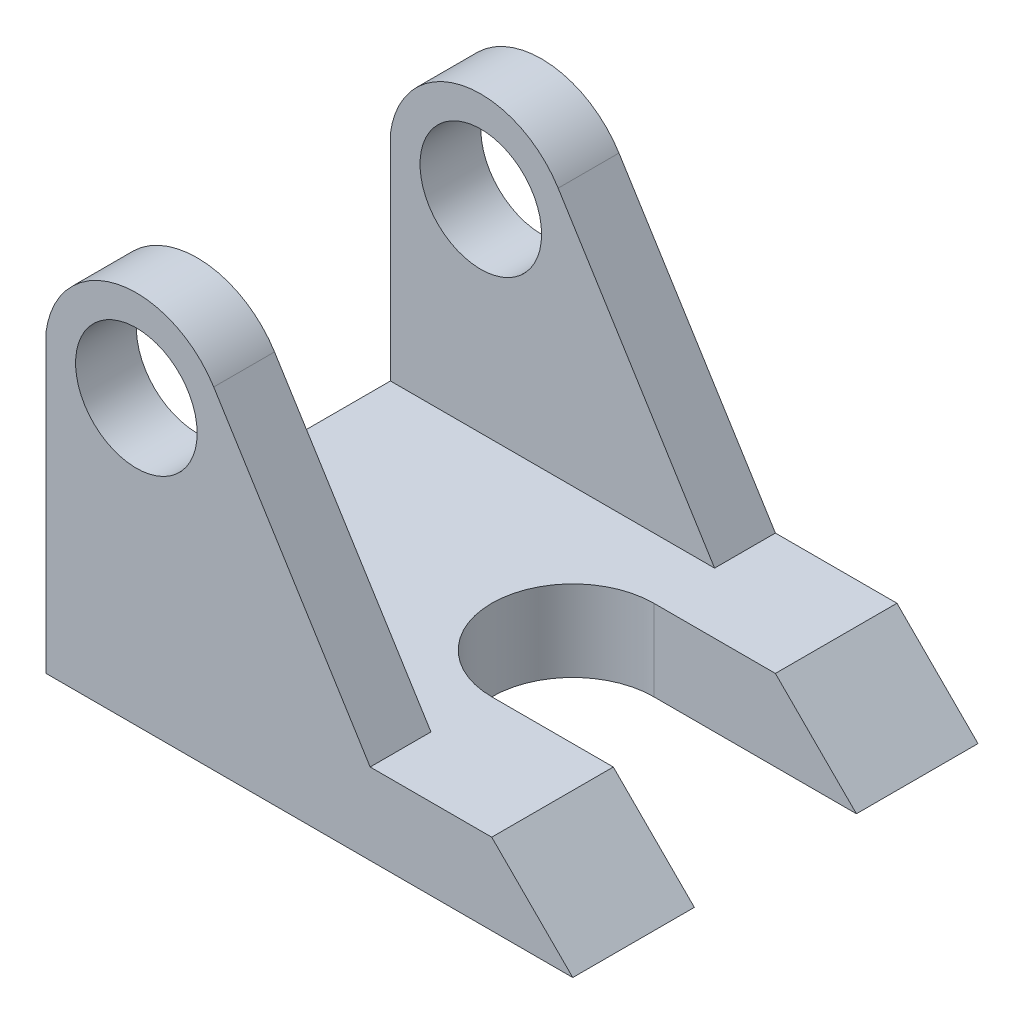
ISO-10303-21;
HEADER;
FILE_DESCRIPTION(('STEP AP214'),'2;1');
FILE_NAME('part.step','',(''),(''),'','','');
FILE_SCHEMA(('AUTOMOTIVE_DESIGN { 1 0 10303 214 1 1 1 1 }'));
ENDSEC;
DATA;
#1=APPLICATION_CONTEXT('core data for automotive mechanical design processes');
#2=APPLICATION_PROTOCOL_DEFINITION('international standard','automotive_design',2000,#1);
#3=PRODUCT_CONTEXT('',#1,'mechanical');
#4=PRODUCT('Part','Part','',(#3));
#5=PRODUCT_RELATED_PRODUCT_CATEGORY('part','',(#4));
#6=PRODUCT_DEFINITION_FORMATION('','',#4);
#7=PRODUCT_DEFINITION_CONTEXT('part definition',#1,'design');
#8=PRODUCT_DEFINITION('design','',#6,#7);
#9=PRODUCT_DEFINITION_SHAPE('','',#8);
#10=(LENGTH_UNIT() NAMED_UNIT(*) SI_UNIT(.MILLI.,.METRE.));
#11=(NAMED_UNIT(*) PLANE_ANGLE_UNIT() SI_UNIT($,.RADIAN.));
#12=(NAMED_UNIT(*) SI_UNIT($,.STERADIAN.) SOLID_ANGLE_UNIT());
#13=UNCERTAINTY_MEASURE_WITH_UNIT(LENGTH_MEASURE(1.E-05),#10,'distance_accuracy_value','');
#14=(GEOMETRIC_REPRESENTATION_CONTEXT(3) GLOBAL_UNCERTAINTY_ASSIGNED_CONTEXT((#13)) GLOBAL_UNIT_ASSIGNED_CONTEXT((#10,
#11,#12)) REPRESENTATION_CONTEXT('',''));
#15=CARTESIAN_POINT('',(0.,0.,0.));
#16=DIRECTION('',(0.,0.,1.));
#17=DIRECTION('',(1.,0.,0.));
#18=AXIS2_PLACEMENT_3D('',#15,#16,#17);
#19=CARTESIAN_POINT('',(-65.,20.,-100.));
#20=DIRECTION('',(0.,-1.,0.));
#21=DIRECTION('',(1.,0.,0.));
#22=AXIS2_PLACEMENT_3D('',#19,#20,#21);
#23=PLANE('',#22);
#24=DIRECTION('',(1.,0.,0.));
#25=VECTOR('',#24,1.);
#26=CARTESIAN_POINT('',(-65.,20.,-100.));
#27=LINE('',#26,#25);
#28=CARTESIAN_POINT('',(14.9999999999998,20.,-100.));
#29=VERTEX_POINT('',#28);
#30=CARTESIAN_POINT('',(44.9999999999998,20.,-100.));
#31=VERTEX_POINT('',#30);
#32=EDGE_CURVE('E255',#29,#31,#27,.T.);
#33=ORIENTED_EDGE('',*,*,#32,.F.);
#34=DIRECTION('',(0.,0.,-1.));
#35=VECTOR('',#34,1.);
#36=CARTESIAN_POINT('',(14.9999999999998,20.,-85.));
#37=LINE('',#36,#35);
#38=CARTESIAN_POINT('',(14.9999999999998,20.,-85.));
#39=VERTEX_POINT('',#38);
#40=EDGE_CURVE('E170',#39,#29,#37,.T.);
#41=ORIENTED_EDGE('',*,*,#40,.F.);
#42=DIRECTION('',(-1.,0.,0.));
#43=VECTOR('',#42,1.);
#44=CARTESIAN_POINT('',(-65.,20.,-85.));
#45=LINE('',#44,#43);
#46=CARTESIAN_POINT('',(-65.,20.,-85.));
#47=VERTEX_POINT('',#46);
#48=EDGE_CURVE('E156',#39,#47,#45,.T.);
#49=ORIENTED_EDGE('',*,*,#48,.T.);
#50=DIRECTION('',(0.,0.,1.));
#51=VECTOR('',#50,1.);
#52=CARTESIAN_POINT('',(-65.,20.,-100.));
#53=LINE('',#52,#51);
#54=CARTESIAN_POINT('',(-65.,20.,-15.));
#55=VERTEX_POINT('',#54);
#56=EDGE_CURVE('E11',#47,#55,#53,.T.);
#57=ORIENTED_EDGE('',*,*,#56,.T.);
#58=DIRECTION('',(-1.,0.,0.));
#59=VECTOR('',#58,1.);
#60=CARTESIAN_POINT('',(14.9999999999998,20.,-15.));
#61=LINE('',#60,#59);
#62=CARTESIAN_POINT('',(14.9999999999998,20.,-15.));
#63=VERTEX_POINT('',#62);
#64=EDGE_CURVE('E183',#63,#55,#61,.T.);
#65=ORIENTED_EDGE('',*,*,#64,.F.);
#66=DIRECTION('',(0.,0.,1.));
#67=VECTOR('',#66,1.);
#68=CARTESIAN_POINT('',(14.9999999999998,20.,-15.));
#69=LINE('',#68,#67);
#70=CARTESIAN_POINT('',(14.9999999999998,20.,0.));
#71=VERTEX_POINT('',#70);
#72=EDGE_CURVE('E203',#63,#71,#69,.T.);
#73=ORIENTED_EDGE('',*,*,#72,.T.);
#74=DIRECTION('',(1.,0.,0.));
#75=VECTOR('',#74,1.);
#76=CARTESIAN_POINT('',(-65.,20.,0.));
#77=LINE('',#76,#75);
#78=CARTESIAN_POINT('',(44.9999999999998,20.,0.));
#79=VERTEX_POINT('',#78);
#80=EDGE_CURVE('E247',#71,#79,#77,.T.);
#81=ORIENTED_EDGE('',*,*,#80,.T.);
#82=DIRECTION('',(0.,0.,1.));
#83=VECTOR('',#82,1.);
#84=CARTESIAN_POINT('',(44.9999999999998,20.,-100.));
#85=LINE('',#84,#83);
#86=CARTESIAN_POINT('',(44.9999999999998,20.,-30.));
#87=VERTEX_POINT('',#86);
#88=EDGE_CURVE('E275',#87,#79,#85,.T.);
#89=ORIENTED_EDGE('',*,*,#88,.F.);
#90=DIRECTION('',(1.,0.,0.));
#91=VECTOR('',#90,1.);
#92=CARTESIAN_POINT('',(15.,20.,-30.));
#93=LINE('',#92,#91);
#94=CARTESIAN_POINT('',(15.,20.,-30.));
#95=VERTEX_POINT('',#94);
#96=EDGE_CURVE('E212',#95,#87,#93,.T.);
#97=ORIENTED_EDGE('',*,*,#96,.F.);
#98=CARTESIAN_POINT('',(15.,20.,-50.));
#99=DIRECTION('',(0.,1.,0.));
#100=DIRECTION('',(-1.,0.,0.));
#101=AXIS2_PLACEMENT_3D('',#98,#99,#100);
#102=CIRCLE('',#101,20.);
#103=CARTESIAN_POINT('',(15.,20.,-70.));
#104=VERTEX_POINT('',#103);
#105=EDGE_CURVE('E223',#104,#95,#102,.T.);
#106=ORIENTED_EDGE('',*,*,#105,.F.);
#107=DIRECTION('',(-1.,0.,0.));
#108=VECTOR('',#107,1.);
#109=CARTESIAN_POINT('',(65.,20.,-70.));
#110=LINE('',#109,#108);
#111=CARTESIAN_POINT('',(44.9999999999998,20.,-70.));
#112=VERTEX_POINT('',#111);
#113=EDGE_CURVE('E206',#112,#104,#110,.T.);
#114=ORIENTED_EDGE('',*,*,#113,.F.);
#115=EDGE_CURVE('E57',#31,#112,#85,.T.);
#116=ORIENTED_EDGE('',*,*,#115,.F.);
#117=EDGE_LOOP('',(#33,#41,#49,#57,#65,#73,#81,#89,#97,#106,#114,#116));
#118=FACE_BOUND('',#117,.T.);
#119=ADVANCED_FACE('F47',(#118),#23,.F.);
#120=CARTESIAN_POINT('',(65.,0.,-100.));
#121=DIRECTION('',(0.707106781186544,0.707106781186551,0.));
#122=DIRECTION('',(-0.707106781186551,0.707106781186544,0.));
#123=AXIS2_PLACEMENT_3D('',#120,#121,#122);
#124=PLANE('',#123);
#125=DIRECTION('',(-0.707106781186551,0.707106781186544,0.));
#126=VECTOR('',#125,1.);
#127=CARTESIAN_POINT('',(65.,0.,-70.));
#128=LINE('',#127,#126);
#129=CARTESIAN_POINT('',(65.,0.,-70.));
#130=VERTEX_POINT('',#129);
#131=EDGE_CURVE('E238',#130,#112,#128,.T.);
#132=ORIENTED_EDGE('',*,*,#131,.F.);
#133=DIRECTION('',(0.,0.,1.));
#134=VECTOR('',#133,1.);
#135=CARTESIAN_POINT('',(65.,0.,-100.));
#136=LINE('',#135,#134);
#137=CARTESIAN_POINT('',(65.,0.,-100.));
#138=VERTEX_POINT('',#137);
#139=EDGE_CURVE('E276',#138,#130,#136,.T.);
#140=ORIENTED_EDGE('',*,*,#139,.F.);
#141=DIRECTION('',(-0.707106781186551,0.707106781186544,0.));
#142=VECTOR('',#141,1.);
#143=CARTESIAN_POINT('',(65.,0.,-100.));
#144=LINE('',#143,#142);
#145=EDGE_CURVE('E251',#138,#31,#144,.T.);
#146=ORIENTED_EDGE('',*,*,#145,.T.);
#147=ORIENTED_EDGE('',*,*,#115,.T.);
#148=EDGE_LOOP('',(#132,#140,#146,#147));
#149=FACE_BOUND('',#148,.T.);
#150=ADVANCED_FACE('F317',(#149),#124,.T.);
#151=CARTESIAN_POINT('',(-65.,20.,-100.));
#152=DIRECTION('',(-1.,0.,0.));
#153=DIRECTION('',(0.,0.,1.));
#154=AXIS2_PLACEMENT_3D('',#151,#152,#153);
#155=PLANE('',#154);
#156=DIRECTION('',(0.,-1.,0.));
#157=VECTOR('',#156,1.);
#158=CARTESIAN_POINT('',(-65.,20.,0.));
#159=LINE('',#158,#157);
#160=CARTESIAN_POINT('',(-65.,72.9857905895299,0.));
#161=VERTEX_POINT('',#160);
#162=CARTESIAN_POINT('',(-65.,0.,0.));
#163=VERTEX_POINT('',#162);
#164=EDGE_CURVE('E241',#161,#163,#159,.T.);
#165=ORIENTED_EDGE('',*,*,#164,.F.);
#166=DIRECTION('',(0.,0.,1.));
#167=VECTOR('',#166,1.);
#168=CARTESIAN_POINT('',(-65.,72.9857905895299,-15.));
#169=LINE('',#168,#167);
#170=CARTESIAN_POINT('',(-65.,72.9857905895299,-15.));
#171=VERTEX_POINT('',#170);
#172=EDGE_CURVE('E177',#171,#161,#169,.T.);
#173=ORIENTED_EDGE('',*,*,#172,.F.);
#174=DIRECTION('',(0.,1.,0.));
#175=VECTOR('',#174,1.);
#176=CARTESIAN_POINT('',(-65.,20.,-15.));
#177=LINE('',#176,#175);
#178=EDGE_CURVE('E175',#55,#171,#177,.T.);
#179=ORIENTED_EDGE('',*,*,#178,.F.);
#180=ORIENTED_EDGE('',*,*,#56,.F.);
#181=DIRECTION('',(0.,1.,0.));
#182=VECTOR('',#181,1.);
#183=CARTESIAN_POINT('',(-65.,72.9857905895299,-85.));
#184=LINE('',#183,#182);
#185=CARTESIAN_POINT('',(-65.,72.9857905895299,-85.));
#186=VERTEX_POINT('',#185);
#187=EDGE_CURVE('E152',#47,#186,#184,.T.);
#188=ORIENTED_EDGE('',*,*,#187,.T.);
#189=DIRECTION('',(0.,0.,-1.));
#190=VECTOR('',#189,1.);
#191=CARTESIAN_POINT('',(-65.,72.9857905895299,-85.));
#192=LINE('',#191,#190);
#193=CARTESIAN_POINT('',(-65.,72.9857905895299,-100.));
#194=VERTEX_POINT('',#193);
#195=EDGE_CURVE('E321',#186,#194,#192,.T.);
#196=ORIENTED_EDGE('',*,*,#195,.T.);
#197=DIRECTION('',(0.,-1.,0.));
#198=VECTOR('',#197,1.);
#199=CARTESIAN_POINT('',(-65.,20.,-100.));
#200=LINE('',#199,#198);
#201=CARTESIAN_POINT('',(-65.,0.,-100.));
#202=VERTEX_POINT('',#201);
#203=EDGE_CURVE('E242',#194,#202,#200,.T.);
#204=ORIENTED_EDGE('',*,*,#203,.T.);
#205=DIRECTION('',(0.,0.,1.));
#206=VECTOR('',#205,1.);
#207=CARTESIAN_POINT('',(-65.,0.,-100.));
#208=LINE('',#207,#206);
#209=EDGE_CURVE('E258',#202,#163,#208,.T.);
#210=ORIENTED_EDGE('',*,*,#209,.T.);
#211=EDGE_LOOP('',(#165,#173,#179,#180,#188,#196,#204,#210));
#212=FACE_BOUND('',#211,.T.);
#213=ADVANCED_FACE('F49',(#212),#155,.T.);
#214=DIRECTION('',(0.707106781186551,-0.707106781186544,0.));
#215=VECTOR('',#214,1.);
#216=CARTESIAN_POINT('',(65.,0.,-30.));
#217=LINE('',#216,#215);
#218=CARTESIAN_POINT('',(65.,0.,-30.));
#219=VERTEX_POINT('',#218);
#220=EDGE_CURVE('E232',#87,#219,#217,.T.);
#221=ORIENTED_EDGE('',*,*,#220,.F.);
#222=ORIENTED_EDGE('',*,*,#88,.T.);
#223=DIRECTION('',(-0.707106781186551,0.707106781186544,0.));
#224=VECTOR('',#223,1.);
#225=CARTESIAN_POINT('',(65.,0.,0.));
#226=LINE('',#225,#224);
#227=CARTESIAN_POINT('',(65.,0.,0.));
#228=VERTEX_POINT('',#227);
#229=EDGE_CURVE('E266',#228,#79,#226,.T.);
#230=ORIENTED_EDGE('',*,*,#229,.F.);
#231=EDGE_CURVE('E279',#219,#228,#136,.T.);
#232=ORIENTED_EDGE('',*,*,#231,.F.);
#233=EDGE_LOOP('',(#221,#222,#230,#232));
#234=FACE_BOUND('',#233,.T.);
#235=ADVANCED_FACE('F290',(#234),#124,.T.);
#236=CARTESIAN_POINT('',(-65.,0.,-100.));
#237=DIRECTION('',(0.,-1.,0.));
#238=DIRECTION('',(0.,0.,-1.));
#239=AXIS2_PLACEMENT_3D('',#236,#237,#238);
#240=PLANE('',#239);
#241=DIRECTION('',(-1.,0.,0.));
#242=VECTOR('',#241,1.);
#243=CARTESIAN_POINT('',(65.,0.,-70.));
#244=LINE('',#243,#242);
#245=CARTESIAN_POINT('',(15.,0.,-70.));
#246=VERTEX_POINT('',#245);
#247=EDGE_CURVE('E207',#130,#246,#244,.T.);
#248=ORIENTED_EDGE('',*,*,#247,.T.);
#249=CARTESIAN_POINT('',(15.,0.,-50.));
#250=DIRECTION('',(0.,1.,0.));
#251=DIRECTION('',(-1.,0.,0.));
#252=AXIS2_PLACEMENT_3D('',#249,#250,#251);
#253=CIRCLE('',#252,20.);
#254=CARTESIAN_POINT('',(15.,0.,-30.));
#255=VERTEX_POINT('',#254);
#256=EDGE_CURVE('E211',#246,#255,#253,.T.);
#257=ORIENTED_EDGE('',*,*,#256,.T.);
#258=DIRECTION('',(1.,0.,0.));
#259=VECTOR('',#258,1.);
#260=CARTESIAN_POINT('',(15.,0.,-30.));
#261=LINE('',#260,#259);
#262=EDGE_CURVE('E216',#255,#219,#261,.T.);
#263=ORIENTED_EDGE('',*,*,#262,.T.);
#264=ORIENTED_EDGE('',*,*,#231,.T.);
#265=DIRECTION('',(1.,0.,0.));
#266=VECTOR('',#265,1.);
#267=CARTESIAN_POINT('',(-65.,0.,0.));
#268=LINE('',#267,#266);
#269=EDGE_CURVE('E262',#163,#228,#268,.T.);
#270=ORIENTED_EDGE('',*,*,#269,.F.);
#271=ORIENTED_EDGE('',*,*,#209,.F.);
#272=DIRECTION('',(1.,0.,0.));
#273=VECTOR('',#272,1.);
#274=CARTESIAN_POINT('',(-65.,0.,-100.));
#275=LINE('',#274,#273);
#276=EDGE_CURVE('E246',#202,#138,#275,.T.);
#277=ORIENTED_EDGE('',*,*,#276,.T.);
#278=ORIENTED_EDGE('',*,*,#139,.T.);
#279=EDGE_LOOP('',(#248,#257,#263,#264,#270,#271,#277,#278));
#280=FACE_BOUND('',#279,.T.);
#281=ADVANCED_FACE('F286',(#280),#240,.T.);
#282=CARTESIAN_POINT('',(0.,0.,-100.));
#283=DIRECTION('',(0.,0.,1.));
#284=DIRECTION('',(1.,0.,0.));
#285=AXIS2_PLACEMENT_3D('',#282,#283,#284);
#286=PLANE('',#285);
#287=CARTESIAN_POINT('',(-42.6989898310531,70.,-100.));
#288=DIRECTION('',(0.,0.,1.));
#289=DIRECTION('',(1.,0.,0.));
#290=AXIS2_PLACEMENT_3D('',#287,#288,#289);
#291=CIRCLE('',#290,15.);
#292=CARTESIAN_POINT('',(-27.6989898310531,70.,-100.));
#293=VERTEX_POINT('',#292);
#294=EDGE_CURVE('E351',#293,#293,#291,.T.);
#295=ORIENTED_EDGE('',*,*,#294,.T.);
#296=EDGE_LOOP('',(#295));
#297=FACE_BOUND('',#296,.T.);
#298=ORIENTED_EDGE('',*,*,#203,.F.);
#299=CARTESIAN_POINT('',(-42.6989898310531,70.,-100.));
#300=DIRECTION('',(0.,0.,-1.));
#301=DIRECTION('',(1.,0.,0.));
#302=AXIS2_PLACEMENT_3D('',#299,#300,#301);
#303=CIRCLE('',#302,22.5);
#304=CARTESIAN_POINT('',(-23.6073846959793,81.906326610942,-100.));
#305=VERTEX_POINT('',#304);
#306=EDGE_CURVE('E328',#194,#305,#303,.T.);
#307=ORIENTED_EDGE('',*,*,#306,.T.);
#308=DIRECTION('',(0.529170071597421,-0.848515783781057,0.));
#309=VECTOR('',#308,1.);
#310=CARTESIAN_POINT('',(14.9999999999998,20.,-100.));
#311=LINE('',#310,#309);
#312=EDGE_CURVE('E65',#305,#29,#311,.T.);
#313=ORIENTED_EDGE('',*,*,#312,.T.);
#314=ORIENTED_EDGE('',*,*,#32,.T.);
#315=ORIENTED_EDGE('',*,*,#145,.F.);
#316=ORIENTED_EDGE('',*,*,#276,.F.);
#317=EDGE_LOOP('',(#298,#307,#313,#314,#315,#316));
#318=FACE_BOUND('',#317,.T.);
#319=ADVANCED_FACE('F320',(#297,#318),#286,.F.);
#320=CARTESIAN_POINT('',(0.,0.,0.));
#321=DIRECTION('',(0.,0.,1.));
#322=DIRECTION('',(1.,0.,0.));
#323=AXIS2_PLACEMENT_3D('',#320,#321,#322);
#324=PLANE('',#323);
#325=CARTESIAN_POINT('',(-42.6989898310531,70.,0.));
#326=DIRECTION('',(0.,0.,1.));
#327=DIRECTION('',(1.,0.,0.));
#328=AXIS2_PLACEMENT_3D('',#325,#326,#327);
#329=CIRCLE('',#328,15.);
#330=CARTESIAN_POINT('',(-27.6989898310531,70.,0.));
#331=VERTEX_POINT('',#330);
#332=EDGE_CURVE('E347',#331,#331,#329,.T.);
#333=ORIENTED_EDGE('',*,*,#332,.F.);
#334=EDGE_LOOP('',(#333));
#335=FACE_BOUND('',#334,.T.);
#336=ORIENTED_EDGE('',*,*,#164,.T.);
#337=ORIENTED_EDGE('',*,*,#269,.T.);
#338=ORIENTED_EDGE('',*,*,#229,.T.);
#339=ORIENTED_EDGE('',*,*,#80,.F.);
#340=DIRECTION('',(0.529170071597421,-0.848515783781056,0.));
#341=VECTOR('',#340,1.);
#342=CARTESIAN_POINT('',(-23.6073846959793,81.906326610942,0.));
#343=LINE('',#342,#341);
#344=CARTESIAN_POINT('',(-23.6073846959793,81.906326610942,0.));
#345=VERTEX_POINT('',#344);
#346=EDGE_CURVE('E73',#345,#71,#343,.T.);
#347=ORIENTED_EDGE('',*,*,#346,.F.);
#348=CARTESIAN_POINT('',(-42.6989898310531,70.,0.));
#349=DIRECTION('',(0.,0.,1.));
#350=DIRECTION('',(1.,0.,0.));
#351=AXIS2_PLACEMENT_3D('',#348,#349,#350);
#352=CIRCLE('',#351,22.5);
#353=EDGE_CURVE('E195',#345,#161,#352,.T.);
#354=ORIENTED_EDGE('',*,*,#353,.T.);
#355=EDGE_LOOP('',(#336,#337,#338,#339,#347,#354));
#356=FACE_BOUND('',#355,.T.);
#357=ADVANCED_FACE('F294',(#335,#356),#324,.T.);
#358=CARTESIAN_POINT('',(65.,0.,-70.));
#359=DIRECTION('',(0.,0.,-1.));
#360=DIRECTION('',(-1.,0.,0.));
#361=AXIS2_PLACEMENT_3D('',#358,#359,#360);
#362=PLANE('',#361);
#363=ORIENTED_EDGE('',*,*,#131,.T.);
#364=ORIENTED_EDGE('',*,*,#113,.T.);
#365=DIRECTION('',(0.,1.,0.));
#366=VECTOR('',#365,1.);
#367=CARTESIAN_POINT('',(15.,0.,-70.));
#368=LINE('',#367,#366);
#369=EDGE_CURVE('E220',#246,#104,#368,.T.);
#370=ORIENTED_EDGE('',*,*,#369,.F.);
#371=ORIENTED_EDGE('',*,*,#247,.F.);
#372=EDGE_LOOP('',(#363,#364,#370,#371));
#373=FACE_BOUND('',#372,.T.);
#374=ADVANCED_FACE('F313',(#373),#362,.F.);
#375=CARTESIAN_POINT('',(15.,0.,-30.));
#376=DIRECTION('',(0.,0.,1.));
#377=DIRECTION('',(1.,0.,0.));
#378=AXIS2_PLACEMENT_3D('',#375,#376,#377);
#379=PLANE('',#378);
#380=ORIENTED_EDGE('',*,*,#220,.T.);
#381=ORIENTED_EDGE('',*,*,#262,.F.);
#382=DIRECTION('',(0.,1.,0.));
#383=VECTOR('',#382,1.);
#384=CARTESIAN_POINT('',(15.,0.,-30.));
#385=LINE('',#384,#383);
#386=EDGE_CURVE('E229',#255,#95,#385,.T.);
#387=ORIENTED_EDGE('',*,*,#386,.T.);
#388=ORIENTED_EDGE('',*,*,#96,.T.);
#389=EDGE_LOOP('',(#380,#381,#387,#388));
#390=FACE_BOUND('',#389,.T.);
#391=ADVANCED_FACE('F307',(#390),#379,.F.);
#392=CARTESIAN_POINT('',(15.,0.,-50.));
#393=DIRECTION('',(0.,1.,0.));
#394=DIRECTION('',(-1.,0.,0.));
#395=AXIS2_PLACEMENT_3D('',#392,#393,#394);
#396=CYLINDRICAL_SURFACE('',#395,20.);
#397=ORIENTED_EDGE('',*,*,#105,.T.);
#398=ORIENTED_EDGE('',*,*,#386,.F.);
#399=ORIENTED_EDGE('',*,*,#256,.F.);
#400=ORIENTED_EDGE('',*,*,#369,.T.);
#401=EDGE_LOOP('',(#397,#398,#399,#400));
#402=FACE_BOUND('',#401,.T.);
#403=ADVANCED_FACE('F311',(#402),#396,.F.);
#404=CARTESIAN_POINT('',(-23.6073846959793,81.906326610942,-15.));
#405=DIRECTION('',(-0.848515783781057,-0.529170071597421,0.));
#406=DIRECTION('',(0.529170071597421,-0.848515783781057,0.));
#407=AXIS2_PLACEMENT_3D('',#404,#405,#406);
#408=PLANE('',#407);
#409=ORIENTED_EDGE('',*,*,#346,.T.);
#410=ORIENTED_EDGE('',*,*,#72,.F.);
#411=DIRECTION('',(0.529170071597421,-0.848515783781056,0.));
#412=VECTOR('',#411,1.);
#413=CARTESIAN_POINT('',(-23.6073846959793,81.906326610942,-15.));
#414=LINE('',#413,#412);
#415=CARTESIAN_POINT('',(-23.6073846959793,81.906326610942,-15.));
#416=VERTEX_POINT('',#415);
#417=EDGE_CURVE('E189',#416,#63,#414,.T.);
#418=ORIENTED_EDGE('',*,*,#417,.F.);
#419=DIRECTION('',(0.,0.,1.));
#420=VECTOR('',#419,1.);
#421=CARTESIAN_POINT('',(-23.6073846959793,81.906326610942,-15.));
#422=LINE('',#421,#420);
#423=EDGE_CURVE('E187',#416,#345,#422,.T.);
#424=ORIENTED_EDGE('',*,*,#423,.T.);
#425=EDGE_LOOP('',(#409,#410,#418,#424));
#426=FACE_BOUND('',#425,.T.);
#427=ADVANCED_FACE('F301',(#426),#408,.F.);
#428=CARTESIAN_POINT('',(-42.6989898310531,70.,-15.));
#429=DIRECTION('',(0.,0.,1.));
#430=DIRECTION('',(1.,0.,0.));
#431=AXIS2_PLACEMENT_3D('',#428,#429,#430);
#432=CYLINDRICAL_SURFACE('',#431,22.5);
#433=ORIENTED_EDGE('',*,*,#353,.F.);
#434=ORIENTED_EDGE('',*,*,#423,.F.);
#435=CARTESIAN_POINT('',(-42.6989898310531,70.,-15.));
#436=DIRECTION('',(0.,0.,1.));
#437=DIRECTION('',(1.,0.,0.));
#438=AXIS2_PLACEMENT_3D('',#435,#436,#437);
#439=CIRCLE('',#438,22.5);
#440=EDGE_CURVE('E182',#416,#171,#439,.T.);
#441=ORIENTED_EDGE('',*,*,#440,.T.);
#442=ORIENTED_EDGE('',*,*,#172,.T.);
#443=EDGE_LOOP('',(#433,#434,#441,#442));
#444=FACE_BOUND('',#443,.T.);
#445=ADVANCED_FACE('F297',(#444),#432,.T.);
#446=CARTESIAN_POINT('',(-42.6989898310531,70.,-15.));
#447=DIRECTION('',(0.,0.,1.));
#448=DIRECTION('',(1.,0.,0.));
#449=AXIS2_PLACEMENT_3D('',#446,#447,#448);
#450=PLANE('',#449);
#451=CARTESIAN_POINT('',(-42.6989898310531,70.,-15.));
#452=DIRECTION('',(0.,0.,1.));
#453=DIRECTION('',(1.,0.,0.));
#454=AXIS2_PLACEMENT_3D('',#451,#452,#453);
#455=CIRCLE('',#454,15.);
#456=CARTESIAN_POINT('',(-27.6989898310531,70.,-15.));
#457=VERTEX_POINT('',#456);
#458=EDGE_CURVE('E331',#457,#457,#455,.T.);
#459=ORIENTED_EDGE('',*,*,#458,.T.);
#460=EDGE_LOOP('',(#459));
#461=FACE_BOUND('',#460,.T.);
#462=ORIENTED_EDGE('',*,*,#417,.T.);
#463=ORIENTED_EDGE('',*,*,#64,.T.);
#464=ORIENTED_EDGE('',*,*,#178,.T.);
#465=ORIENTED_EDGE('',*,*,#440,.F.);
#466=EDGE_LOOP('',(#462,#463,#464,#465));
#467=FACE_BOUND('',#466,.T.);
#468=ADVANCED_FACE('F299',(#461,#467),#450,.F.);
#469=CARTESIAN_POINT('',(14.9999999999998,20.,-85.));
#470=DIRECTION('',(0.848515783781057,0.529170071597421,0.));
#471=DIRECTION('',(-0.529170071597421,0.848515783781057,0.));
#472=AXIS2_PLACEMENT_3D('',#469,#470,#471);
#473=PLANE('',#472);
#474=ORIENTED_EDGE('',*,*,#312,.F.);
#475=DIRECTION('',(0.,0.,-1.));
#476=VECTOR('',#475,1.);
#477=CARTESIAN_POINT('',(-23.6073846959793,81.906326610942,-85.));
#478=LINE('',#477,#476);
#479=CARTESIAN_POINT('',(-23.6073846959793,81.906326610942,-85.));
#480=VERTEX_POINT('',#479);
#481=EDGE_CURVE('E325',#480,#305,#478,.T.);
#482=ORIENTED_EDGE('',*,*,#481,.F.);
#483=DIRECTION('',(0.529170071597421,-0.848515783781057,0.));
#484=VECTOR('',#483,1.);
#485=CARTESIAN_POINT('',(14.9999999999998,20.,-85.));
#486=LINE('',#485,#484);
#487=EDGE_CURVE('E326',#480,#39,#486,.T.);
#488=ORIENTED_EDGE('',*,*,#487,.T.);
#489=ORIENTED_EDGE('',*,*,#40,.T.);
#490=EDGE_LOOP('',(#474,#482,#488,#489));
#491=FACE_BOUND('',#490,.T.);
#492=ADVANCED_FACE('F372',(#491),#473,.T.);
#493=CARTESIAN_POINT('',(-42.6989898310531,70.,-85.));
#494=DIRECTION('',(0.,0.,-1.));
#495=DIRECTION('',(-1.,0.,0.));
#496=AXIS2_PLACEMENT_3D('',#493,#494,#495);
#497=CYLINDRICAL_SURFACE('',#496,22.5);
#498=ORIENTED_EDGE('',*,*,#306,.F.);
#499=ORIENTED_EDGE('',*,*,#195,.F.);
#500=CARTESIAN_POINT('',(-42.6989898310531,70.,-85.));
#501=DIRECTION('',(0.,0.,-1.));
#502=DIRECTION('',(1.,0.,0.));
#503=AXIS2_PLACEMENT_3D('',#500,#501,#502);
#504=CIRCLE('',#503,22.5);
#505=EDGE_CURVE('E159',#186,#480,#504,.T.);
#506=ORIENTED_EDGE('',*,*,#505,.T.);
#507=ORIENTED_EDGE('',*,*,#481,.T.);
#508=EDGE_LOOP('',(#498,#499,#506,#507));
#509=FACE_BOUND('',#508,.T.);
#510=ADVANCED_FACE('F329',(#509),#497,.T.);
#511=CARTESIAN_POINT('',(-42.6989898310531,70.,-85.));
#512=DIRECTION('',(0.,0.,1.));
#513=DIRECTION('',(1.,0.,0.));
#514=AXIS2_PLACEMENT_3D('',#511,#512,#513);
#515=PLANE('',#514);
#516=CARTESIAN_POINT('',(-42.6989898310531,70.,-85.));
#517=DIRECTION('',(0.,0.,1.));
#518=DIRECTION('',(1.,0.,0.));
#519=AXIS2_PLACEMENT_3D('',#516,#517,#518);
#520=CIRCLE('',#519,15.);
#521=CARTESIAN_POINT('',(-27.6989898310531,70.,-85.));
#522=VERTEX_POINT('',#521);
#523=EDGE_CURVE('E51',#522,#522,#520,.T.);
#524=ORIENTED_EDGE('',*,*,#523,.F.);
#525=EDGE_LOOP('',(#524));
#526=FACE_BOUND('',#525,.T.);
#527=ORIENTED_EDGE('',*,*,#48,.F.);
#528=ORIENTED_EDGE('',*,*,#487,.F.);
#529=ORIENTED_EDGE('',*,*,#505,.F.);
#530=ORIENTED_EDGE('',*,*,#187,.F.);
#531=EDGE_LOOP('',(#527,#528,#529,#530));
#532=FACE_BOUND('',#531,.T.);
#533=ADVANCED_FACE('F154',(#526,#532),#515,.T.);
#534=CARTESIAN_POINT('',(-42.6989898310531,70.,-100.));
#535=DIRECTION('',(0.,0.,1.));
#536=DIRECTION('',(1.,0.,0.));
#537=AXIS2_PLACEMENT_3D('',#534,#535,#536);
#538=CYLINDRICAL_SURFACE('',#537,15.);
#539=ORIENTED_EDGE('',*,*,#523,.T.);
#540=EDGE_LOOP('',(#539));
#541=FACE_BOUND('',#540,.T.);
#542=ORIENTED_EDGE('',*,*,#294,.F.);
#543=EDGE_LOOP('',(#542));
#544=FACE_BOUND('',#543,.T.);
#545=ADVANCED_FACE('F360',(#541,#544),#538,.F.);
#546=ORIENTED_EDGE('',*,*,#332,.T.);
#547=EDGE_LOOP('',(#546));
#548=FACE_BOUND('',#547,.T.);
#549=ORIENTED_EDGE('',*,*,#458,.F.);
#550=EDGE_LOOP('',(#549));
#551=FACE_BOUND('',#550,.T.);
#552=ADVANCED_FACE('F369',(#548,#551),#538,.F.);
#553=CLOSED_SHELL('',(#119,#150,#213,#235,#281,#319,#357,#374,#391,#403,#427,#445,#468,#492,
#510,#533,#545,#552));
#554=MANIFOLD_SOLID_BREP('B2',#553);
#555=ADVANCED_BREP_SHAPE_REPRESENTATION('',(#18,#554),#14);
#556=SHAPE_DEFINITION_REPRESENTATION(#9,#555);
ENDSEC;
END-ISO-10303-21;
